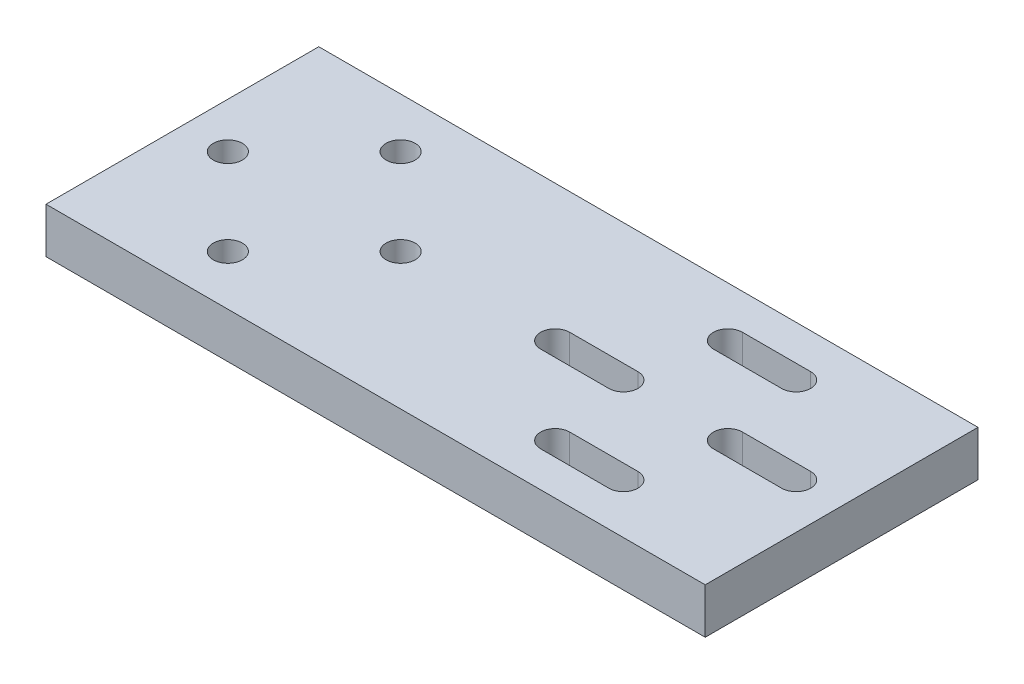
ISO-10303-21;
HEADER;
FILE_DESCRIPTION(('STEP AP214'),'2;1');
FILE_NAME('part.step','',(''),(''),'','','');
FILE_SCHEMA(('AUTOMOTIVE_DESIGN { 1 0 10303 214 1 1 1 1 }'));
ENDSEC;
DATA;
#1=APPLICATION_CONTEXT('core data for automotive mechanical design processes');
#2=APPLICATION_PROTOCOL_DEFINITION('international standard','automotive_design',2000,#1);
#3=PRODUCT_CONTEXT('',#1,'mechanical');
#4=PRODUCT('Part','Part','',(#3));
#5=PRODUCT_RELATED_PRODUCT_CATEGORY('part','',(#4));
#6=PRODUCT_DEFINITION_FORMATION('','',#4);
#7=PRODUCT_DEFINITION_CONTEXT('part definition',#1,'design');
#8=PRODUCT_DEFINITION('design','',#6,#7);
#9=PRODUCT_DEFINITION_SHAPE('','',#8);
#10=(LENGTH_UNIT() NAMED_UNIT(*) SI_UNIT(.MILLI.,.METRE.));
#11=(NAMED_UNIT(*) PLANE_ANGLE_UNIT() SI_UNIT($,.RADIAN.));
#12=(NAMED_UNIT(*) SI_UNIT($,.STERADIAN.) SOLID_ANGLE_UNIT());
#13=UNCERTAINTY_MEASURE_WITH_UNIT(LENGTH_MEASURE(1.E-05),#10,'distance_accuracy_value','');
#14=(GEOMETRIC_REPRESENTATION_CONTEXT(3) GLOBAL_UNCERTAINTY_ASSIGNED_CONTEXT((#13)) GLOBAL_UNIT_ASSIGNED_CONTEXT((#10,
#11,#12)) REPRESENTATION_CONTEXT('',''));
#15=CARTESIAN_POINT('',(0.,0.,0.));
#16=DIRECTION('',(0.,0.,1.));
#17=DIRECTION('',(1.,0.,0.));
#18=AXIS2_PLACEMENT_3D('',#15,#16,#17);
#19=CARTESIAN_POINT('',(18.,0.,9.5));
#20=DIRECTION('',(0.,1.,0.));
#21=DIRECTION('',(0.,0.,1.));
#22=AXIS2_PLACEMENT_3D('',#19,#20,#21);
#23=CYLINDRICAL_SURFACE('',#22,1.6);
#24=DIRECTION('',(0.,1.,0.));
#25=VECTOR('',#24,1.);
#26=CARTESIAN_POINT('',(18.,0.,7.9));
#27=LINE('',#26,#25);
#28=CARTESIAN_POINT('',(18.,5.,7.9));
#29=VERTEX_POINT('',#28);
#30=CARTESIAN_POINT('',(18.,0.,7.9));
#31=VERTEX_POINT('',#30);
#32=EDGE_CURVE('E268',#29,#31,#27,.F.);
#33=ORIENTED_EDGE('',*,*,#32,.F.);
#34=CARTESIAN_POINT('',(18.,5.,9.5));
#35=DIRECTION('',(0.,1.,0.));
#36=DIRECTION('',(0.,0.,-1.));
#37=AXIS2_PLACEMENT_3D('',#34,#35,#36);
#38=CIRCLE('',#37,1.6);
#39=CARTESIAN_POINT('',(18.,5.,11.1));
#40=VERTEX_POINT('',#39);
#41=EDGE_CURVE('E197',#29,#40,#38,.T.);
#42=ORIENTED_EDGE('',*,*,#41,.T.);
#43=DIRECTION('',(0.,1.,0.));
#44=VECTOR('',#43,1.);
#45=CARTESIAN_POINT('',(18.,0.,11.1));
#46=LINE('',#45,#44);
#47=CARTESIAN_POINT('',(18.,0.,11.1));
#48=VERTEX_POINT('',#47);
#49=EDGE_CURVE('E266',#40,#48,#46,.F.);
#50=ORIENTED_EDGE('',*,*,#49,.T.);
#51=CARTESIAN_POINT('',(18.,0.,9.5));
#52=DIRECTION('',(0.,1.,0.));
#53=DIRECTION('',(0.,0.,-1.));
#54=AXIS2_PLACEMENT_3D('',#51,#52,#53);
#55=CIRCLE('',#54,1.6);
#56=EDGE_CURVE('E232',#31,#48,#55,.T.);
#57=ORIENTED_EDGE('',*,*,#56,.F.);
#58=EDGE_LOOP('',(#33,#42,#50,#57));
#59=FACE_BOUND('',#58,.T.);
#60=ADVANCED_FACE('F33',(#59),#23,.F.);
#61=CARTESIAN_POINT('',(27.5,0.,0.));
#62=DIRECTION('',(0.,1.,0.));
#63=DIRECTION('',(0.,0.,1.));
#64=AXIS2_PLACEMENT_3D('',#61,#62,#63);
#65=CYLINDRICAL_SURFACE('',#64,1.6);
#66=DIRECTION('',(0.,1.,0.));
#67=VECTOR('',#66,1.);
#68=CARTESIAN_POINT('',(27.5,0.,-1.6));
#69=LINE('',#68,#67);
#70=CARTESIAN_POINT('',(27.5,5.,-1.6));
#71=VERTEX_POINT('',#70);
#72=CARTESIAN_POINT('',(27.5,0.,-1.6));
#73=VERTEX_POINT('',#72);
#74=EDGE_CURVE('E179',#71,#73,#69,.F.);
#75=ORIENTED_EDGE('',*,*,#74,.F.);
#76=CARTESIAN_POINT('',(27.5,5.,0.));
#77=DIRECTION('',(0.,1.,0.));
#78=DIRECTION('',(0.,0.,-1.));
#79=AXIS2_PLACEMENT_3D('',#76,#77,#78);
#80=CIRCLE('',#79,1.6);
#81=CARTESIAN_POINT('',(27.5,5.,1.6));
#82=VERTEX_POINT('',#81);
#83=EDGE_CURVE('E187',#71,#82,#80,.T.);
#84=ORIENTED_EDGE('',*,*,#83,.T.);
#85=DIRECTION('',(0.,1.,0.));
#86=VECTOR('',#85,1.);
#87=CARTESIAN_POINT('',(27.5,0.,1.6));
#88=LINE('',#87,#86);
#89=CARTESIAN_POINT('',(27.5,0.,1.6));
#90=VERTEX_POINT('',#89);
#91=EDGE_CURVE('E170',#82,#90,#88,.F.);
#92=ORIENTED_EDGE('',*,*,#91,.T.);
#93=CARTESIAN_POINT('',(27.5,0.,0.));
#94=DIRECTION('',(0.,1.,0.));
#95=DIRECTION('',(0.,0.,-1.));
#96=AXIS2_PLACEMENT_3D('',#93,#94,#95);
#97=CIRCLE('',#96,1.6);
#98=EDGE_CURVE('E194',#73,#90,#97,.T.);
#99=ORIENTED_EDGE('',*,*,#98,.F.);
#100=EDGE_LOOP('',(#75,#84,#92,#99));
#101=FACE_BOUND('',#100,.T.);
#102=ADVANCED_FACE('F193',(#101),#65,.F.);
#103=CARTESIAN_POINT('',(18.,0.,-9.5));
#104=DIRECTION('',(0.,1.,0.));
#105=DIRECTION('',(0.,0.,1.));
#106=AXIS2_PLACEMENT_3D('',#103,#104,#105);
#107=CYLINDRICAL_SURFACE('',#106,1.6);
#108=DIRECTION('',(0.,1.,0.));
#109=VECTOR('',#108,1.);
#110=CARTESIAN_POINT('',(18.,0.,-11.1));
#111=LINE('',#110,#109);
#112=CARTESIAN_POINT('',(18.,5.,-11.1));
#113=VERTEX_POINT('',#112);
#114=CARTESIAN_POINT('',(18.,0.,-11.1));
#115=VERTEX_POINT('',#114);
#116=EDGE_CURVE('E180',#113,#115,#111,.F.);
#117=ORIENTED_EDGE('',*,*,#116,.F.);
#118=CARTESIAN_POINT('',(18.,5.,-9.5));
#119=DIRECTION('',(0.,1.,0.));
#120=DIRECTION('',(0.,0.,-1.));
#121=AXIS2_PLACEMENT_3D('',#118,#119,#120);
#122=CIRCLE('',#121,1.6);
#123=CARTESIAN_POINT('',(18.,5.,-7.9));
#124=VERTEX_POINT('',#123);
#125=EDGE_CURVE('E200',#113,#124,#122,.T.);
#126=ORIENTED_EDGE('',*,*,#125,.T.);
#127=DIRECTION('',(0.,1.,0.));
#128=VECTOR('',#127,1.);
#129=CARTESIAN_POINT('',(18.,0.,-7.9));
#130=LINE('',#129,#128);
#131=CARTESIAN_POINT('',(18.,0.,-7.9));
#132=VERTEX_POINT('',#131);
#133=EDGE_CURVE('E261',#124,#132,#130,.F.);
#134=ORIENTED_EDGE('',*,*,#133,.T.);
#135=CARTESIAN_POINT('',(18.,0.,-9.5));
#136=DIRECTION('',(0.,1.,0.));
#137=DIRECTION('',(0.,0.,-1.));
#138=AXIS2_PLACEMENT_3D('',#135,#136,#137);
#139=CIRCLE('',#138,1.6);
#140=EDGE_CURVE('E195',#115,#132,#139,.T.);
#141=ORIENTED_EDGE('',*,*,#140,.F.);
#142=EDGE_LOOP('',(#117,#126,#134,#141));
#143=FACE_BOUND('',#142,.T.);
#144=ADVANCED_FACE('F399',(#143),#107,.F.);
#145=CARTESIAN_POINT('',(8.5,0.,0.));
#146=DIRECTION('',(0.,1.,0.));
#147=DIRECTION('',(0.,0.,1.));
#148=AXIS2_PLACEMENT_3D('',#145,#146,#147);
#149=CYLINDRICAL_SURFACE('',#148,1.6);
#150=DIRECTION('',(0.,1.,0.));
#151=VECTOR('',#150,1.);
#152=CARTESIAN_POINT('',(8.5,0.,-1.6));
#153=LINE('',#152,#151);
#154=CARTESIAN_POINT('',(8.5,5.,-1.6));
#155=VERTEX_POINT('',#154);
#156=CARTESIAN_POINT('',(8.5,0.,-1.6));
#157=VERTEX_POINT('',#156);
#158=EDGE_CURVE('E259',#155,#157,#153,.F.);
#159=ORIENTED_EDGE('',*,*,#158,.F.);
#160=CARTESIAN_POINT('',(8.5,5.,0.));
#161=DIRECTION('',(0.,1.,0.));
#162=DIRECTION('',(0.,0.,-1.));
#163=AXIS2_PLACEMENT_3D('',#160,#161,#162);
#164=CIRCLE('',#163,1.6);
#165=CARTESIAN_POINT('',(8.5,5.,1.6));
#166=VERTEX_POINT('',#165);
#167=EDGE_CURVE('E209',#155,#166,#164,.T.);
#168=ORIENTED_EDGE('',*,*,#167,.T.);
#169=DIRECTION('',(0.,1.,0.));
#170=VECTOR('',#169,1.);
#171=CARTESIAN_POINT('',(8.5,0.,1.6));
#172=LINE('',#171,#170);
#173=CARTESIAN_POINT('',(8.5,0.,1.6));
#174=VERTEX_POINT('',#173);
#175=EDGE_CURVE('E256',#166,#174,#172,.F.);
#176=ORIENTED_EDGE('',*,*,#175,.T.);
#177=CARTESIAN_POINT('',(8.5,0.,0.));
#178=DIRECTION('',(0.,1.,0.));
#179=DIRECTION('',(0.,0.,-1.));
#180=AXIS2_PLACEMENT_3D('',#177,#178,#179);
#181=CIRCLE('',#180,1.6);
#182=EDGE_CURVE('E206',#157,#174,#181,.T.);
#183=ORIENTED_EDGE('',*,*,#182,.F.);
#184=EDGE_LOOP('',(#159,#168,#176,#183));
#185=FACE_BOUND('',#184,.T.);
#186=ADVANCED_FACE('F392',(#185),#149,.F.);
#187=CARTESIAN_POINT('',(-32.5,5.,-15.));
#188=DIRECTION('',(0.,0.,1.));
#189=DIRECTION('',(1.,0.,0.));
#190=AXIS2_PLACEMENT_3D('',#187,#188,#189);
#191=PLANE('',#190);
#192=DIRECTION('',(-1.,0.,0.));
#193=VECTOR('',#192,1.);
#194=CARTESIAN_POINT('',(-32.5,0.,-15.));
#195=LINE('',#194,#193);
#196=CARTESIAN_POINT('',(40.,0.,-15.));
#197=VERTEX_POINT('',#196);
#198=CARTESIAN_POINT('',(-32.5,0.,-15.));
#199=VERTEX_POINT('',#198);
#200=EDGE_CURVE('E245',#197,#199,#195,.T.);
#201=ORIENTED_EDGE('',*,*,#200,.T.);
#202=DIRECTION('',(0.,-1.,0.));
#203=VECTOR('',#202,1.);
#204=CARTESIAN_POINT('',(-32.5,5.,-15.));
#205=LINE('',#204,#203);
#206=CARTESIAN_POINT('',(-32.5,5.,-15.));
#207=VERTEX_POINT('',#206);
#208=EDGE_CURVE('E253',#207,#199,#205,.T.);
#209=ORIENTED_EDGE('',*,*,#208,.F.);
#210=DIRECTION('',(-1.,0.,0.));
#211=VECTOR('',#210,1.);
#212=CARTESIAN_POINT('',(-32.5,5.,-15.));
#213=LINE('',#212,#211);
#214=CARTESIAN_POINT('',(40.,5.,-15.));
#215=VERTEX_POINT('',#214);
#216=EDGE_CURVE('E237',#215,#207,#213,.T.);
#217=ORIENTED_EDGE('',*,*,#216,.F.);
#218=DIRECTION('',(0.,1.,0.));
#219=VECTOR('',#218,1.);
#220=CARTESIAN_POINT('',(40.,0.,-15.));
#221=LINE('',#220,#219);
#222=EDGE_CURVE('E347',#197,#215,#221,.T.);
#223=ORIENTED_EDGE('',*,*,#222,.F.);
#224=EDGE_LOOP('',(#201,#209,#217,#223));
#225=FACE_BOUND('',#224,.T.);
#226=ADVANCED_FACE('F35',(#225),#191,.F.);
#227=CARTESIAN_POINT('',(-32.5,5.,-15.));
#228=DIRECTION('',(1.,0.,0.));
#229=DIRECTION('',(0.,0.,-1.));
#230=AXIS2_PLACEMENT_3D('',#227,#228,#229);
#231=PLANE('',#230);
#232=DIRECTION('',(0.,0.,1.));
#233=VECTOR('',#232,1.);
#234=CARTESIAN_POINT('',(-32.5,0.,-15.));
#235=LINE('',#234,#233);
#236=CARTESIAN_POINT('',(-32.5,0.,15.));
#237=VERTEX_POINT('',#236);
#238=EDGE_CURVE('E247',#199,#237,#235,.T.);
#239=ORIENTED_EDGE('',*,*,#238,.T.);
#240=DIRECTION('',(0.,-1.,0.));
#241=VECTOR('',#240,1.);
#242=CARTESIAN_POINT('',(-32.5,5.,15.));
#243=LINE('',#242,#241);
#244=CARTESIAN_POINT('',(-32.5,5.,15.));
#245=VERTEX_POINT('',#244);
#246=EDGE_CURVE('E244',#245,#237,#243,.T.);
#247=ORIENTED_EDGE('',*,*,#246,.F.);
#248=DIRECTION('',(0.,0.,1.));
#249=VECTOR('',#248,1.);
#250=CARTESIAN_POINT('',(-32.5,5.,-15.));
#251=LINE('',#250,#249);
#252=EDGE_CURVE('E239',#207,#245,#251,.T.);
#253=ORIENTED_EDGE('',*,*,#252,.F.);
#254=ORIENTED_EDGE('',*,*,#208,.T.);
#255=EDGE_LOOP('',(#239,#247,#253,#254));
#256=FACE_BOUND('',#255,.T.);
#257=ADVANCED_FACE('F385',(#256),#231,.F.);
#258=CARTESIAN_POINT('',(-32.5,5.,15.));
#259=DIRECTION('',(0.,0.,-1.));
#260=DIRECTION('',(-1.,0.,0.));
#261=AXIS2_PLACEMENT_3D('',#258,#259,#260);
#262=PLANE('',#261);
#263=DIRECTION('',(1.,0.,0.));
#264=VECTOR('',#263,1.);
#265=CARTESIAN_POINT('',(-32.5,0.,15.));
#266=LINE('',#265,#264);
#267=CARTESIAN_POINT('',(40.,0.,15.));
#268=VERTEX_POINT('',#267);
#269=EDGE_CURVE('E240',#237,#268,#266,.T.);
#270=ORIENTED_EDGE('',*,*,#269,.T.);
#271=DIRECTION('',(0.,-1.,0.));
#272=VECTOR('',#271,1.);
#273=CARTESIAN_POINT('',(40.,5.,15.));
#274=LINE('',#273,#272);
#275=CARTESIAN_POINT('',(40.,5.,15.));
#276=VERTEX_POINT('',#275);
#277=EDGE_CURVE('E341',#276,#268,#274,.T.);
#278=ORIENTED_EDGE('',*,*,#277,.F.);
#279=DIRECTION('',(1.,0.,0.));
#280=VECTOR('',#279,1.);
#281=CARTESIAN_POINT('',(-32.5,5.,15.));
#282=LINE('',#281,#280);
#283=EDGE_CURVE('E242',#245,#276,#282,.T.);
#284=ORIENTED_EDGE('',*,*,#283,.F.);
#285=ORIENTED_EDGE('',*,*,#246,.T.);
#286=EDGE_LOOP('',(#270,#278,#284,#285));
#287=FACE_BOUND('',#286,.T.);
#288=ADVANCED_FACE('F360',(#287),#262,.F.);
#289=CARTESIAN_POINT('',(0.,5.,0.));
#290=DIRECTION('',(0.,1.,0.));
#291=DIRECTION('',(0.,0.,1.));
#292=AXIS2_PLACEMENT_3D('',#289,#290,#291);
#293=PLANE('',#292);
#294=DIRECTION('',(-1.,0.,0.));
#295=VECTOR('',#294,1.);
#296=CARTESIAN_POINT('',(18.,5.,-11.1));
#297=LINE('',#296,#295);
#298=CARTESIAN_POINT('',(25.5,5.,-11.1));
#299=VERTEX_POINT('',#298);
#300=EDGE_CURVE('E304',#299,#113,#297,.T.);
#301=ORIENTED_EDGE('',*,*,#300,.F.);
#302=CARTESIAN_POINT('',(25.5,5.,-9.5));
#303=DIRECTION('',(0.,1.,0.));
#304=DIRECTION('',(0.,0.,1.));
#305=AXIS2_PLACEMENT_3D('',#302,#303,#304);
#306=CIRCLE('',#305,1.6);
#307=CARTESIAN_POINT('',(25.5,5.,-7.9));
#308=VERTEX_POINT('',#307);
#309=EDGE_CURVE('E301',#308,#299,#306,.T.);
#310=ORIENTED_EDGE('',*,*,#309,.F.);
#311=DIRECTION('',(1.,0.,0.));
#312=VECTOR('',#311,1.);
#313=CARTESIAN_POINT('',(18.,5.,-7.9));
#314=LINE('',#313,#312);
#315=EDGE_CURVE('E298',#124,#308,#314,.T.);
#316=ORIENTED_EDGE('',*,*,#315,.F.);
#317=ORIENTED_EDGE('',*,*,#125,.F.);
#318=EDGE_LOOP('',(#301,#310,#316,#317));
#319=FACE_BOUND('',#318,.T.);
#320=DIRECTION('',(-1.,0.,0.));
#321=VECTOR('',#320,1.);
#322=CARTESIAN_POINT('',(18.,5.,7.9));
#323=LINE('',#322,#321);
#324=CARTESIAN_POINT('',(25.5,5.,7.9));
#325=VERTEX_POINT('',#324);
#326=EDGE_CURVE('E292',#325,#29,#323,.T.);
#327=ORIENTED_EDGE('',*,*,#326,.F.);
#328=CARTESIAN_POINT('',(25.5,5.,9.5));
#329=DIRECTION('',(0.,1.,0.));
#330=DIRECTION('',(0.,0.,1.));
#331=AXIS2_PLACEMENT_3D('',#328,#329,#330);
#332=CIRCLE('',#331,1.6);
#333=CARTESIAN_POINT('',(25.5,5.,11.1));
#334=VERTEX_POINT('',#333);
#335=EDGE_CURVE('E295',#334,#325,#332,.T.);
#336=ORIENTED_EDGE('',*,*,#335,.F.);
#337=DIRECTION('',(1.,0.,0.));
#338=VECTOR('',#337,1.);
#339=CARTESIAN_POINT('',(18.,5.,11.1));
#340=LINE('',#339,#338);
#341=EDGE_CURVE('E290',#40,#334,#340,.T.);
#342=ORIENTED_EDGE('',*,*,#341,.F.);
#343=ORIENTED_EDGE('',*,*,#41,.F.);
#344=EDGE_LOOP('',(#327,#336,#342,#343));
#345=FACE_BOUND('',#344,.T.);
#346=DIRECTION('',(-1.,0.,0.));
#347=VECTOR('',#346,1.);
#348=CARTESIAN_POINT('',(27.5,5.,-1.6));
#349=LINE('',#348,#347);
#350=CARTESIAN_POINT('',(35.,5.,-1.6));
#351=VERTEX_POINT('',#350);
#352=EDGE_CURVE('E423',#351,#71,#349,.T.);
#353=ORIENTED_EDGE('',*,*,#352,.F.);
#354=CARTESIAN_POINT('',(35.,5.,0.));
#355=DIRECTION('',(0.,1.,0.));
#356=DIRECTION('',(0.,0.,1.));
#357=AXIS2_PLACEMENT_3D('',#354,#355,#356);
#358=CIRCLE('',#357,1.6);
#359=CARTESIAN_POINT('',(35.,5.,1.6));
#360=VERTEX_POINT('',#359);
#361=EDGE_CURVE('E189',#360,#351,#358,.T.);
#362=ORIENTED_EDGE('',*,*,#361,.F.);
#363=DIRECTION('',(1.,0.,0.));
#364=VECTOR('',#363,1.);
#365=CARTESIAN_POINT('',(27.5,5.,1.6));
#366=LINE('',#365,#364);
#367=EDGE_CURVE('E173',#82,#360,#366,.T.);
#368=ORIENTED_EDGE('',*,*,#367,.F.);
#369=ORIENTED_EDGE('',*,*,#83,.F.);
#370=EDGE_LOOP('',(#353,#362,#368,#369));
#371=FACE_BOUND('',#370,.T.);
#372=DIRECTION('',(-1.,0.,0.));
#373=VECTOR('',#372,1.);
#374=CARTESIAN_POINT('',(8.5,5.,-1.6));
#375=LINE('',#374,#373);
#376=CARTESIAN_POINT('',(16.,5.,-1.6));
#377=VERTEX_POINT('',#376);
#378=EDGE_CURVE('E317',#377,#155,#375,.T.);
#379=ORIENTED_EDGE('',*,*,#378,.F.);
#380=CARTESIAN_POINT('',(16.,5.,0.));
#381=DIRECTION('',(0.,1.,0.));
#382=DIRECTION('',(0.,0.,1.));
#383=AXIS2_PLACEMENT_3D('',#380,#381,#382);
#384=CIRCLE('',#383,1.6);
#385=CARTESIAN_POINT('',(16.,5.,1.6));
#386=VERTEX_POINT('',#385);
#387=EDGE_CURVE('E313',#386,#377,#384,.T.);
#388=ORIENTED_EDGE('',*,*,#387,.F.);
#389=DIRECTION('',(1.,0.,0.));
#390=VECTOR('',#389,1.);
#391=CARTESIAN_POINT('',(8.5,5.,1.6));
#392=LINE('',#391,#390);
#393=EDGE_CURVE('E310',#166,#386,#392,.T.);
#394=ORIENTED_EDGE('',*,*,#393,.F.);
#395=ORIENTED_EDGE('',*,*,#167,.F.);
#396=EDGE_LOOP('',(#379,#388,#394,#395));
#397=FACE_BOUND('',#396,.T.);
#398=CARTESIAN_POINT('',(-27.5,5.,0.));
#399=DIRECTION('',(0.,1.,0.));
#400=DIRECTION('',(0.,0.,1.));
#401=AXIS2_PLACEMENT_3D('',#398,#399,#400);
#402=CIRCLE('',#401,1.6);
#403=CARTESIAN_POINT('',(-27.5,5.,1.6));
#404=VERTEX_POINT('',#403);
#405=EDGE_CURVE('E216',#404,#404,#402,.T.);
#406=ORIENTED_EDGE('',*,*,#405,.F.);
#407=EDGE_LOOP('',(#406));
#408=FACE_BOUND('',#407,.T.);
#409=CARTESIAN_POINT('',(-18.,5.,9.5));
#410=DIRECTION('',(0.,1.,0.));
#411=DIRECTION('',(0.,0.,1.));
#412=AXIS2_PLACEMENT_3D('',#409,#410,#411);
#413=CIRCLE('',#412,1.6);
#414=CARTESIAN_POINT('',(-18.,5.,11.1));
#415=VERTEX_POINT('',#414);
#416=EDGE_CURVE('E229',#415,#415,#413,.T.);
#417=ORIENTED_EDGE('',*,*,#416,.F.);
#418=EDGE_LOOP('',(#417));
#419=FACE_BOUND('',#418,.T.);
#420=CARTESIAN_POINT('',(-8.5,5.,0.));
#421=DIRECTION('',(0.,1.,0.));
#422=DIRECTION('',(0.,0.,1.));
#423=AXIS2_PLACEMENT_3D('',#420,#421,#422);
#424=CIRCLE('',#423,1.6);
#425=CARTESIAN_POINT('',(-8.5,5.,1.6));
#426=VERTEX_POINT('',#425);
#427=EDGE_CURVE('E223',#426,#426,#424,.T.);
#428=ORIENTED_EDGE('',*,*,#427,.F.);
#429=EDGE_LOOP('',(#428));
#430=FACE_BOUND('',#429,.T.);
#431=CARTESIAN_POINT('',(-18.,5.,-9.5));
#432=DIRECTION('',(0.,1.,0.));
#433=DIRECTION('',(0.,0.,1.));
#434=AXIS2_PLACEMENT_3D('',#431,#432,#433);
#435=CIRCLE('',#434,1.6);
#436=CARTESIAN_POINT('',(-18.,5.,-7.9));
#437=VERTEX_POINT('',#436);
#438=EDGE_CURVE('E217',#437,#437,#435,.T.);
#439=ORIENTED_EDGE('',*,*,#438,.F.);
#440=EDGE_LOOP('',(#439));
#441=FACE_BOUND('',#440,.T.);
#442=ORIENTED_EDGE('',*,*,#283,.T.);
#443=DIRECTION('',(0.,0.,1.));
#444=VECTOR('',#443,1.);
#445=CARTESIAN_POINT('',(40.,5.,-15.));
#446=LINE('',#445,#444);
#447=EDGE_CURVE('E212',#215,#276,#446,.T.);
#448=ORIENTED_EDGE('',*,*,#447,.F.);
#449=ORIENTED_EDGE('',*,*,#216,.T.);
#450=ORIENTED_EDGE('',*,*,#252,.T.);
#451=EDGE_LOOP('',(#442,#448,#449,#450));
#452=FACE_BOUND('',#451,.T.);
#453=ADVANCED_FACE('F185',(#319,#345,#371,#397,#408,#419,#430,#441,#452),#293,.T.);
#454=CARTESIAN_POINT('',(0.,0.,0.));
#455=DIRECTION('',(0.,1.,0.));
#456=DIRECTION('',(0.,0.,1.));
#457=AXIS2_PLACEMENT_3D('',#454,#455,#456);
#458=PLANE('',#457);
#459=CARTESIAN_POINT('',(-27.5,0.,0.));
#460=DIRECTION('',(0.,1.,0.));
#461=DIRECTION('',(0.,0.,1.));
#462=AXIS2_PLACEMENT_3D('',#459,#460,#461);
#463=CIRCLE('',#462,1.6);
#464=CARTESIAN_POINT('',(-27.5,0.,1.6));
#465=VERTEX_POINT('',#464);
#466=EDGE_CURVE('E248',#465,#465,#463,.T.);
#467=ORIENTED_EDGE('',*,*,#466,.T.);
#468=EDGE_LOOP('',(#467));
#469=FACE_BOUND('',#468,.T.);
#470=CARTESIAN_POINT('',(16.,0.,0.));
#471=DIRECTION('',(0.,1.,0.));
#472=DIRECTION('',(0.,0.,1.));
#473=AXIS2_PLACEMENT_3D('',#470,#471,#472);
#474=CIRCLE('',#473,1.6);
#475=CARTESIAN_POINT('',(16.,0.,1.6));
#476=VERTEX_POINT('',#475);
#477=CARTESIAN_POINT('',(16.,0.,-1.6));
#478=VERTEX_POINT('',#477);
#479=EDGE_CURVE('E270',#476,#478,#474,.T.);
#480=ORIENTED_EDGE('',*,*,#479,.T.);
#481=DIRECTION('',(-1.,0.,0.));
#482=VECTOR('',#481,1.);
#483=CARTESIAN_POINT('',(0.,0.,-1.6));
#484=LINE('',#483,#482);
#485=EDGE_CURVE('E326',#478,#157,#484,.T.);
#486=ORIENTED_EDGE('',*,*,#485,.T.);
#487=ORIENTED_EDGE('',*,*,#182,.T.);
#488=DIRECTION('',(1.,0.,0.));
#489=VECTOR('',#488,1.);
#490=CARTESIAN_POINT('',(0.,0.,1.6));
#491=LINE('',#490,#489);
#492=EDGE_CURVE('E322',#174,#476,#491,.T.);
#493=ORIENTED_EDGE('',*,*,#492,.T.);
#494=EDGE_LOOP('',(#480,#486,#487,#493));
#495=FACE_BOUND('',#494,.T.);
#496=CARTESIAN_POINT('',(25.5,0.,-9.5));
#497=DIRECTION('',(0.,1.,0.));
#498=DIRECTION('',(0.,0.,1.));
#499=AXIS2_PLACEMENT_3D('',#496,#497,#498);
#500=CIRCLE('',#499,1.6);
#501=CARTESIAN_POINT('',(25.5,0.,-7.9));
#502=VERTEX_POINT('',#501);
#503=CARTESIAN_POINT('',(25.5,0.,-11.1));
#504=VERTEX_POINT('',#503);
#505=EDGE_CURVE('E11',#502,#504,#500,.T.);
#506=ORIENTED_EDGE('',*,*,#505,.T.);
#507=DIRECTION('',(-1.,0.,0.));
#508=VECTOR('',#507,1.);
#509=CARTESIAN_POINT('',(0.,0.,-11.1));
#510=LINE('',#509,#508);
#511=EDGE_CURVE('E332',#504,#115,#510,.T.);
#512=ORIENTED_EDGE('',*,*,#511,.T.);
#513=ORIENTED_EDGE('',*,*,#140,.T.);
#514=DIRECTION('',(1.,0.,0.));
#515=VECTOR('',#514,1.);
#516=CARTESIAN_POINT('',(0.,0.,-7.9));
#517=LINE('',#516,#515);
#518=EDGE_CURVE('E329',#132,#502,#517,.T.);
#519=ORIENTED_EDGE('',*,*,#518,.T.);
#520=EDGE_LOOP('',(#506,#512,#513,#519));
#521=FACE_BOUND('',#520,.T.);
#522=CARTESIAN_POINT('',(35.,0.,0.));
#523=DIRECTION('',(0.,1.,0.));
#524=DIRECTION('',(0.,0.,1.));
#525=AXIS2_PLACEMENT_3D('',#522,#523,#524);
#526=CIRCLE('',#525,1.6);
#527=CARTESIAN_POINT('',(35.,0.,1.6));
#528=VERTEX_POINT('',#527);
#529=CARTESIAN_POINT('',(35.,0.,-1.6));
#530=VERTEX_POINT('',#529);
#531=EDGE_CURVE('E273',#528,#530,#526,.T.);
#532=ORIENTED_EDGE('',*,*,#531,.T.);
#533=DIRECTION('',(-1.,0.,0.));
#534=VECTOR('',#533,1.);
#535=CARTESIAN_POINT('',(0.,0.,-1.6));
#536=LINE('',#535,#534);
#537=EDGE_CURVE('E336',#530,#73,#536,.T.);
#538=ORIENTED_EDGE('',*,*,#537,.T.);
#539=ORIENTED_EDGE('',*,*,#98,.T.);
#540=DIRECTION('',(1.,0.,0.));
#541=VECTOR('',#540,1.);
#542=CARTESIAN_POINT('',(0.,0.,1.6));
#543=LINE('',#542,#541);
#544=EDGE_CURVE('E56',#90,#528,#543,.T.);
#545=ORIENTED_EDGE('',*,*,#544,.T.);
#546=EDGE_LOOP('',(#532,#538,#539,#545));
#547=FACE_BOUND('',#546,.T.);
#548=CARTESIAN_POINT('',(25.5,0.,9.5));
#549=DIRECTION('',(0.,1.,0.));
#550=DIRECTION('',(0.,0.,1.));
#551=AXIS2_PLACEMENT_3D('',#548,#549,#550);
#552=CIRCLE('',#551,1.6);
#553=CARTESIAN_POINT('',(25.5,0.,11.1));
#554=VERTEX_POINT('',#553);
#555=CARTESIAN_POINT('',(25.5,0.,7.9));
#556=VERTEX_POINT('',#555);
#557=EDGE_CURVE('E41',#554,#556,#552,.T.);
#558=ORIENTED_EDGE('',*,*,#557,.T.);
#559=DIRECTION('',(-1.,0.,0.));
#560=VECTOR('',#559,1.);
#561=CARTESIAN_POINT('',(0.,0.,7.9));
#562=LINE('',#561,#560);
#563=EDGE_CURVE('E280',#556,#31,#562,.T.);
#564=ORIENTED_EDGE('',*,*,#563,.T.);
#565=ORIENTED_EDGE('',*,*,#56,.T.);
#566=DIRECTION('',(1.,0.,0.));
#567=VECTOR('',#566,1.);
#568=CARTESIAN_POINT('',(0.,0.,11.1));
#569=LINE('',#568,#567);
#570=EDGE_CURVE('E48',#48,#554,#569,.T.);
#571=ORIENTED_EDGE('',*,*,#570,.T.);
#572=EDGE_LOOP('',(#558,#564,#565,#571));
#573=FACE_BOUND('',#572,.T.);
#574=CARTESIAN_POINT('',(-18.,0.,9.5));
#575=DIRECTION('',(0.,1.,0.));
#576=DIRECTION('',(0.,0.,1.));
#577=AXIS2_PLACEMENT_3D('',#574,#575,#576);
#578=CIRCLE('',#577,1.6);
#579=CARTESIAN_POINT('',(-18.,0.,11.1));
#580=VERTEX_POINT('',#579);
#581=EDGE_CURVE('E226',#580,#580,#578,.T.);
#582=ORIENTED_EDGE('',*,*,#581,.T.);
#583=EDGE_LOOP('',(#582));
#584=FACE_BOUND('',#583,.T.);
#585=CARTESIAN_POINT('',(-8.5,0.,0.));
#586=DIRECTION('',(0.,1.,0.));
#587=DIRECTION('',(0.,0.,1.));
#588=AXIS2_PLACEMENT_3D('',#585,#586,#587);
#589=CIRCLE('',#588,1.6);
#590=CARTESIAN_POINT('',(-8.5,0.,1.6));
#591=VERTEX_POINT('',#590);
#592=EDGE_CURVE('E220',#591,#591,#589,.T.);
#593=ORIENTED_EDGE('',*,*,#592,.T.);
#594=EDGE_LOOP('',(#593));
#595=FACE_BOUND('',#594,.T.);
#596=CARTESIAN_POINT('',(-18.,0.,-9.5));
#597=DIRECTION('',(0.,1.,0.));
#598=DIRECTION('',(0.,0.,1.));
#599=AXIS2_PLACEMENT_3D('',#596,#597,#598);
#600=CIRCLE('',#599,1.6);
#601=CARTESIAN_POINT('',(-18.,0.,-7.9));
#602=VERTEX_POINT('',#601);
#603=EDGE_CURVE('E213',#602,#602,#600,.T.);
#604=ORIENTED_EDGE('',*,*,#603,.T.);
#605=EDGE_LOOP('',(#604));
#606=FACE_BOUND('',#605,.T.);
#607=ORIENTED_EDGE('',*,*,#200,.F.);
#608=DIRECTION('',(0.,0.,-1.));
#609=VECTOR('',#608,1.);
#610=CARTESIAN_POINT('',(40.,0.,15.));
#611=LINE('',#610,#609);
#612=EDGE_CURVE('E344',#268,#197,#611,.T.);
#613=ORIENTED_EDGE('',*,*,#612,.F.);
#614=ORIENTED_EDGE('',*,*,#269,.F.);
#615=ORIENTED_EDGE('',*,*,#238,.F.);
#616=EDGE_LOOP('',(#607,#613,#614,#615));
#617=FACE_BOUND('',#616,.T.);
#618=ADVANCED_FACE('F278',(#469,#495,#521,#547,#573,#584,#595,#606,#617),#458,.F.);
#619=CARTESIAN_POINT('',(-18.,0.,-9.5));
#620=DIRECTION('',(0.,1.,0.));
#621=DIRECTION('',(0.,0.,1.));
#622=AXIS2_PLACEMENT_3D('',#619,#620,#621);
#623=CYLINDRICAL_SURFACE('',#622,1.6);
#624=ORIENTED_EDGE('',*,*,#603,.F.);
#625=EDGE_LOOP('',(#624));
#626=FACE_BOUND('',#625,.T.);
#627=ORIENTED_EDGE('',*,*,#438,.T.);
#628=EDGE_LOOP('',(#627));
#629=FACE_BOUND('',#628,.T.);
#630=ADVANCED_FACE('F407',(#626,#629),#623,.F.);
#631=CARTESIAN_POINT('',(-8.5,0.,0.));
#632=DIRECTION('',(0.,1.,0.));
#633=DIRECTION('',(0.,0.,1.));
#634=AXIS2_PLACEMENT_3D('',#631,#632,#633);
#635=CYLINDRICAL_SURFACE('',#634,1.6);
#636=ORIENTED_EDGE('',*,*,#592,.F.);
#637=EDGE_LOOP('',(#636));
#638=FACE_BOUND('',#637,.T.);
#639=ORIENTED_EDGE('',*,*,#427,.T.);
#640=EDGE_LOOP('',(#639));
#641=FACE_BOUND('',#640,.T.);
#642=ADVANCED_FACE('F412',(#638,#641),#635,.F.);
#643=CARTESIAN_POINT('',(-18.,0.,9.5));
#644=DIRECTION('',(0.,1.,0.));
#645=DIRECTION('',(0.,0.,1.));
#646=AXIS2_PLACEMENT_3D('',#643,#644,#645);
#647=CYLINDRICAL_SURFACE('',#646,1.6);
#648=ORIENTED_EDGE('',*,*,#581,.F.);
#649=EDGE_LOOP('',(#648));
#650=FACE_BOUND('',#649,.T.);
#651=ORIENTED_EDGE('',*,*,#416,.T.);
#652=EDGE_LOOP('',(#651));
#653=FACE_BOUND('',#652,.T.);
#654=ADVANCED_FACE('F403',(#650,#653),#647,.F.);
#655=CARTESIAN_POINT('',(-27.5,0.,0.));
#656=DIRECTION('',(0.,1.,0.));
#657=DIRECTION('',(0.,0.,1.));
#658=AXIS2_PLACEMENT_3D('',#655,#656,#657);
#659=CYLINDRICAL_SURFACE('',#658,1.6);
#660=ORIENTED_EDGE('',*,*,#466,.F.);
#661=EDGE_LOOP('',(#660));
#662=FACE_BOUND('',#661,.T.);
#663=ORIENTED_EDGE('',*,*,#405,.T.);
#664=EDGE_LOOP('',(#663));
#665=FACE_BOUND('',#664,.T.);
#666=ADVANCED_FACE('F356',(#662,#665),#659,.F.);
#667=CARTESIAN_POINT('',(40.,0.,0.));
#668=DIRECTION('',(1.,0.,0.));
#669=DIRECTION('',(0.,0.,-1.));
#670=AXIS2_PLACEMENT_3D('',#667,#668,#669);
#671=PLANE('',#670);
#672=ORIENTED_EDGE('',*,*,#277,.T.);
#673=ORIENTED_EDGE('',*,*,#612,.T.);
#674=ORIENTED_EDGE('',*,*,#222,.T.);
#675=ORIENTED_EDGE('',*,*,#447,.T.);
#676=EDGE_LOOP('',(#672,#673,#674,#675));
#677=FACE_BOUND('',#676,.T.);
#678=ADVANCED_FACE('F376',(#677),#671,.T.);
#679=CARTESIAN_POINT('',(16.,-5.,0.));
#680=DIRECTION('',(0.,1.,0.));
#681=DIRECTION('',(0.,0.,1.));
#682=AXIS2_PLACEMENT_3D('',#679,#680,#681);
#683=CYLINDRICAL_SURFACE('',#682,1.6);
#684=DIRECTION('',(0.,1.,0.));
#685=VECTOR('',#684,1.);
#686=CARTESIAN_POINT('',(16.,-5.,1.6));
#687=LINE('',#686,#685);
#688=EDGE_CURVE('E319',#476,#386,#687,.T.);
#689=ORIENTED_EDGE('',*,*,#688,.T.);
#690=ORIENTED_EDGE('',*,*,#387,.T.);
#691=DIRECTION('',(0.,1.,0.));
#692=VECTOR('',#691,1.);
#693=CARTESIAN_POINT('',(16.,-5.,-1.6));
#694=LINE('',#693,#692);
#695=EDGE_CURVE('E320',#478,#377,#694,.T.);
#696=ORIENTED_EDGE('',*,*,#695,.F.);
#697=ORIENTED_EDGE('',*,*,#479,.F.);
#698=EDGE_LOOP('',(#689,#690,#696,#697));
#699=FACE_BOUND('',#698,.T.);
#700=ADVANCED_FACE('F461',(#699),#683,.F.);
#701=CARTESIAN_POINT('',(8.5,-5.,-1.6));
#702=DIRECTION('',(0.,0.,-1.));
#703=DIRECTION('',(-1.,0.,0.));
#704=AXIS2_PLACEMENT_3D('',#701,#702,#703);
#705=PLANE('',#704);
#706=ORIENTED_EDGE('',*,*,#695,.T.);
#707=ORIENTED_EDGE('',*,*,#378,.T.);
#708=ORIENTED_EDGE('',*,*,#158,.T.);
#709=ORIENTED_EDGE('',*,*,#485,.F.);
#710=EDGE_LOOP('',(#706,#707,#708,#709));
#711=FACE_BOUND('',#710,.T.);
#712=ADVANCED_FACE('F458',(#711),#705,.F.);
#713=CARTESIAN_POINT('',(8.5,-5.,1.6));
#714=DIRECTION('',(0.,0.,1.));
#715=DIRECTION('',(1.,0.,0.));
#716=AXIS2_PLACEMENT_3D('',#713,#714,#715);
#717=PLANE('',#716);
#718=ORIENTED_EDGE('',*,*,#175,.F.);
#719=ORIENTED_EDGE('',*,*,#393,.T.);
#720=ORIENTED_EDGE('',*,*,#688,.F.);
#721=ORIENTED_EDGE('',*,*,#492,.F.);
#722=EDGE_LOOP('',(#718,#719,#720,#721));
#723=FACE_BOUND('',#722,.T.);
#724=ADVANCED_FACE('F453',(#723),#717,.F.);
#725=CARTESIAN_POINT('',(25.5,-5.,-9.5));
#726=DIRECTION('',(0.,1.,0.));
#727=DIRECTION('',(0.,0.,1.));
#728=AXIS2_PLACEMENT_3D('',#725,#726,#727);
#729=CYLINDRICAL_SURFACE('',#728,1.6);
#730=DIRECTION('',(0.,1.,0.));
#731=VECTOR('',#730,1.);
#732=CARTESIAN_POINT('',(25.5,-5.,-7.9));
#733=LINE('',#732,#731);
#734=EDGE_CURVE('E306',#502,#308,#733,.T.);
#735=ORIENTED_EDGE('',*,*,#734,.T.);
#736=ORIENTED_EDGE('',*,*,#309,.T.);
#737=DIRECTION('',(0.,1.,0.));
#738=VECTOR('',#737,1.);
#739=CARTESIAN_POINT('',(25.5,-5.,-11.1));
#740=LINE('',#739,#738);
#741=EDGE_CURVE('E307',#504,#299,#740,.T.);
#742=ORIENTED_EDGE('',*,*,#741,.F.);
#743=ORIENTED_EDGE('',*,*,#505,.F.);
#744=EDGE_LOOP('',(#735,#736,#742,#743));
#745=FACE_BOUND('',#744,.T.);
#746=ADVANCED_FACE('F449',(#745),#729,.F.);
#747=CARTESIAN_POINT('',(18.,-5.,-11.1));
#748=DIRECTION('',(0.,0.,-1.));
#749=DIRECTION('',(-1.,0.,0.));
#750=AXIS2_PLACEMENT_3D('',#747,#748,#749);
#751=PLANE('',#750);
#752=ORIENTED_EDGE('',*,*,#741,.T.);
#753=ORIENTED_EDGE('',*,*,#300,.T.);
#754=ORIENTED_EDGE('',*,*,#116,.T.);
#755=ORIENTED_EDGE('',*,*,#511,.F.);
#756=EDGE_LOOP('',(#752,#753,#754,#755));
#757=FACE_BOUND('',#756,.T.);
#758=ADVANCED_FACE('F445',(#757),#751,.F.);
#759=CARTESIAN_POINT('',(18.,-5.,-7.9));
#760=DIRECTION('',(0.,0.,1.));
#761=DIRECTION('',(1.,0.,0.));
#762=AXIS2_PLACEMENT_3D('',#759,#760,#761);
#763=PLANE('',#762);
#764=ORIENTED_EDGE('',*,*,#133,.F.);
#765=ORIENTED_EDGE('',*,*,#315,.T.);
#766=ORIENTED_EDGE('',*,*,#734,.F.);
#767=ORIENTED_EDGE('',*,*,#518,.F.);
#768=EDGE_LOOP('',(#764,#765,#766,#767));
#769=FACE_BOUND('',#768,.T.);
#770=ADVANCED_FACE('F448',(#769),#763,.F.);
#771=CARTESIAN_POINT('',(35.,-5.,0.));
#772=DIRECTION('',(0.,1.,0.));
#773=DIRECTION('',(0.,0.,1.));
#774=AXIS2_PLACEMENT_3D('',#771,#772,#773);
#775=CYLINDRICAL_SURFACE('',#774,1.6);
#776=DIRECTION('',(0.,1.,0.));
#777=VECTOR('',#776,1.);
#778=CARTESIAN_POINT('',(35.,-5.,1.6));
#779=LINE('',#778,#777);
#780=EDGE_CURVE('E422',#528,#360,#779,.T.);
#781=ORIENTED_EDGE('',*,*,#780,.T.);
#782=ORIENTED_EDGE('',*,*,#361,.T.);
#783=DIRECTION('',(0.,1.,0.));
#784=VECTOR('',#783,1.);
#785=CARTESIAN_POINT('',(35.,-5.,-1.6));
#786=LINE('',#785,#784);
#787=EDGE_CURVE('E314',#530,#351,#786,.T.);
#788=ORIENTED_EDGE('',*,*,#787,.F.);
#789=ORIENTED_EDGE('',*,*,#531,.F.);
#790=EDGE_LOOP('',(#781,#782,#788,#789));
#791=FACE_BOUND('',#790,.T.);
#792=ADVANCED_FACE('F421',(#791),#775,.F.);
#793=CARTESIAN_POINT('',(27.5,-5.,-1.6));
#794=DIRECTION('',(0.,0.,-1.));
#795=DIRECTION('',(-1.,0.,0.));
#796=AXIS2_PLACEMENT_3D('',#793,#794,#795);
#797=PLANE('',#796);
#798=ORIENTED_EDGE('',*,*,#787,.T.);
#799=ORIENTED_EDGE('',*,*,#352,.T.);
#800=ORIENTED_EDGE('',*,*,#74,.T.);
#801=ORIENTED_EDGE('',*,*,#537,.F.);
#802=EDGE_LOOP('',(#798,#799,#800,#801));
#803=FACE_BOUND('',#802,.T.);
#804=ADVANCED_FACE('F535',(#803),#797,.F.);
#805=CARTESIAN_POINT('',(27.5,-5.,1.6));
#806=DIRECTION('',(0.,0.,1.));
#807=DIRECTION('',(1.,0.,0.));
#808=AXIS2_PLACEMENT_3D('',#805,#806,#807);
#809=PLANE('',#808);
#810=ORIENTED_EDGE('',*,*,#91,.F.);
#811=ORIENTED_EDGE('',*,*,#367,.T.);
#812=ORIENTED_EDGE('',*,*,#780,.F.);
#813=ORIENTED_EDGE('',*,*,#544,.F.);
#814=EDGE_LOOP('',(#810,#811,#812,#813));
#815=FACE_BOUND('',#814,.T.);
#816=ADVANCED_FACE('F172',(#815),#809,.F.);
#817=CARTESIAN_POINT('',(25.5,-5.,9.5));
#818=DIRECTION('',(0.,1.,0.));
#819=DIRECTION('',(0.,0.,1.));
#820=AXIS2_PLACEMENT_3D('',#817,#818,#819);
#821=CYLINDRICAL_SURFACE('',#820,1.6);
#822=DIRECTION('',(0.,1.,0.));
#823=VECTOR('',#822,1.);
#824=CARTESIAN_POINT('',(25.5,-5.,11.1));
#825=LINE('',#824,#823);
#826=EDGE_CURVE('E286',#554,#334,#825,.T.);
#827=ORIENTED_EDGE('',*,*,#826,.T.);
#828=ORIENTED_EDGE('',*,*,#335,.T.);
#829=DIRECTION('',(0.,1.,0.));
#830=VECTOR('',#829,1.);
#831=CARTESIAN_POINT('',(25.5,-5.,7.9));
#832=LINE('',#831,#830);
#833=EDGE_CURVE('E190',#556,#325,#832,.T.);
#834=ORIENTED_EDGE('',*,*,#833,.F.);
#835=ORIENTED_EDGE('',*,*,#557,.F.);
#836=EDGE_LOOP('',(#827,#828,#834,#835));
#837=FACE_BOUND('',#836,.T.);
#838=ADVANCED_FACE('F284',(#837),#821,.F.);
#839=CARTESIAN_POINT('',(18.,-5.,7.9));
#840=DIRECTION('',(0.,0.,-1.));
#841=DIRECTION('',(-1.,0.,0.));
#842=AXIS2_PLACEMENT_3D('',#839,#840,#841);
#843=PLANE('',#842);
#844=ORIENTED_EDGE('',*,*,#833,.T.);
#845=ORIENTED_EDGE('',*,*,#326,.T.);
#846=ORIENTED_EDGE('',*,*,#32,.T.);
#847=ORIENTED_EDGE('',*,*,#563,.F.);
#848=EDGE_LOOP('',(#844,#845,#846,#847));
#849=FACE_BOUND('',#848,.T.);
#850=ADVANCED_FACE('F433',(#849),#843,.F.);
#851=CARTESIAN_POINT('',(18.,-5.,11.1));
#852=DIRECTION('',(0.,0.,1.));
#853=DIRECTION('',(1.,0.,0.));
#854=AXIS2_PLACEMENT_3D('',#851,#852,#853);
#855=PLANE('',#854);
#856=ORIENTED_EDGE('',*,*,#49,.F.);
#857=ORIENTED_EDGE('',*,*,#341,.T.);
#858=ORIENTED_EDGE('',*,*,#826,.F.);
#859=ORIENTED_EDGE('',*,*,#570,.F.);
#860=EDGE_LOOP('',(#856,#857,#858,#859));
#861=FACE_BOUND('',#860,.T.);
#862=ADVANCED_FACE('F288',(#861),#855,.F.);
#863=CLOSED_SHELL('',(#60,#102,#144,#186,#226,#257,#288,#453,#618,#630,#642,#654,#666,#678,#700,
#712,#724,#746,#758,#770,#792,#804,#816,#838,#850,#862));
#864=MANIFOLD_SOLID_BREP('B2',#863);
#865=ADVANCED_BREP_SHAPE_REPRESENTATION('',(#18,#864),#14);
#866=SHAPE_DEFINITION_REPRESENTATION(#9,#865);
ENDSEC;
END-ISO-10303-21;
